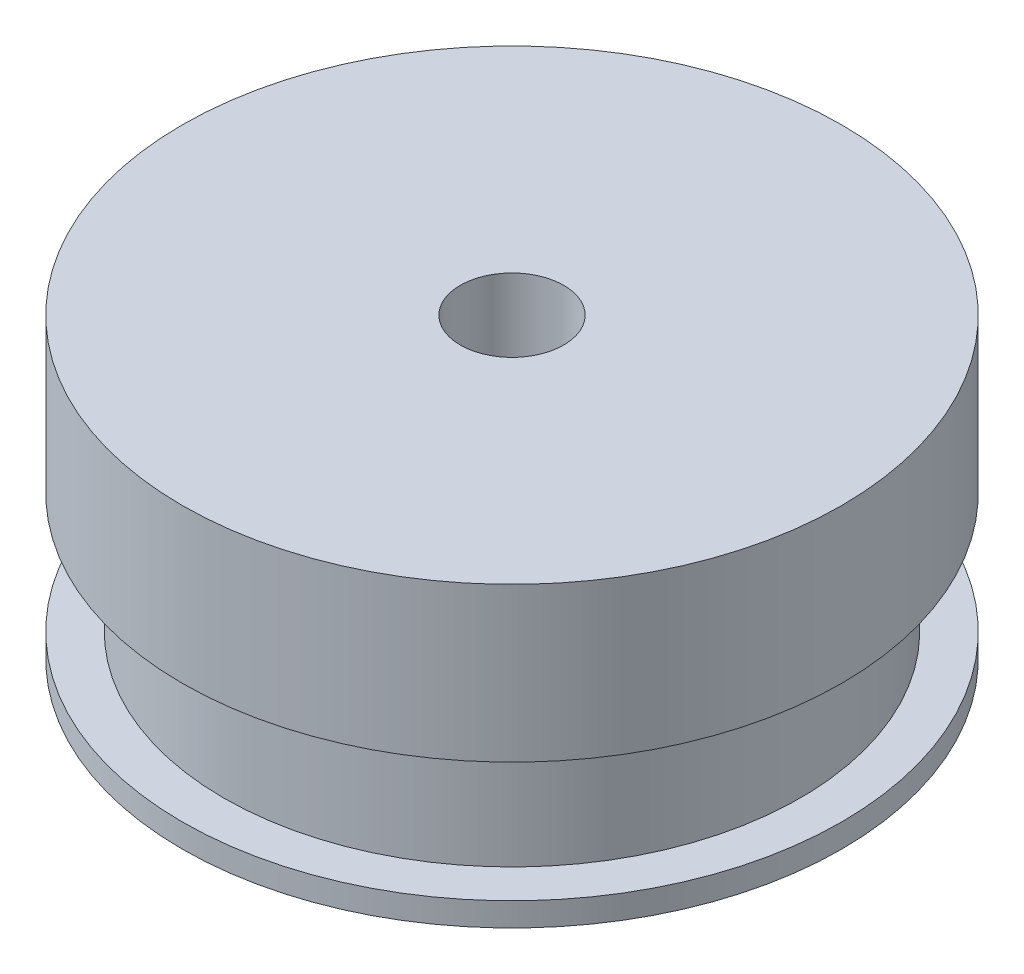
ISO-10303-21;
HEADER;
FILE_DESCRIPTION(('STEP AP214'),'2;1');
FILE_NAME('part.step','',(''),(''),'','','');
FILE_SCHEMA(('AUTOMOTIVE_DESIGN { 1 0 10303 214 1 1 1 1 }'));
ENDSEC;
DATA;
#1=APPLICATION_CONTEXT('core data for automotive mechanical design processes');
#2=APPLICATION_PROTOCOL_DEFINITION('international standard','automotive_design',2000,#1);
#3=PRODUCT_CONTEXT('',#1,'mechanical');
#4=PRODUCT('Part','Part','',(#3));
#5=PRODUCT_RELATED_PRODUCT_CATEGORY('part','',(#4));
#6=PRODUCT_DEFINITION_FORMATION('','',#4);
#7=PRODUCT_DEFINITION_CONTEXT('part definition',#1,'design');
#8=PRODUCT_DEFINITION('design','',#6,#7);
#9=PRODUCT_DEFINITION_SHAPE('','',#8);
#10=(LENGTH_UNIT() NAMED_UNIT(*) SI_UNIT(.MILLI.,.METRE.));
#11=(NAMED_UNIT(*) PLANE_ANGLE_UNIT() SI_UNIT($,.RADIAN.));
#12=(NAMED_UNIT(*) SI_UNIT($,.STERADIAN.) SOLID_ANGLE_UNIT());
#13=UNCERTAINTY_MEASURE_WITH_UNIT(LENGTH_MEASURE(1.E-05),#10,'distance_accuracy_value','');
#14=(GEOMETRIC_REPRESENTATION_CONTEXT(3) GLOBAL_UNCERTAINTY_ASSIGNED_CONTEXT((#13)) GLOBAL_UNIT_ASSIGNED_CONTEXT((#10,
#11,#12)) REPRESENTATION_CONTEXT('',''));
#15=CARTESIAN_POINT('',(0.,0.,0.));
#16=DIRECTION('',(0.,0.,1.));
#17=DIRECTION('',(1.,0.,0.));
#18=AXIS2_PLACEMENT_3D('',#15,#16,#17);
#19=CARTESIAN_POINT('',(0.,18.2626,0.));
#20=DIRECTION('',(0.,-1.,0.));
#21=DIRECTION('',(0.,0.,-1.));
#22=AXIS2_PLACEMENT_3D('',#19,#20,#21);
#23=CYLINDRICAL_SURFACE('',#22,20.2311);
#24=CARTESIAN_POINT('',(0.,0.,0.));
#25=DIRECTION('',(0.,1.,0.));
#26=DIRECTION('',(0.,0.,1.));
#27=AXIS2_PLACEMENT_3D('',#24,#25,#26);
#28=CIRCLE('',#27,20.2311);
#29=CARTESIAN_POINT('',(0.,0.,20.2311));
#30=VERTEX_POINT('',#29);
#31=EDGE_CURVE('E34',#30,#30,#28,.T.);
#32=ORIENTED_EDGE('',*,*,#31,.T.);
#33=EDGE_LOOP('',(#32));
#34=FACE_BOUND('',#33,.T.);
#35=CARTESIAN_POINT('',(0.,1.4478,0.));
#36=DIRECTION('',(0.,1.,0.));
#37=DIRECTION('',(0.,0.,1.));
#38=AXIS2_PLACEMENT_3D('',#35,#36,#37);
#39=CIRCLE('',#38,20.2311);
#40=CARTESIAN_POINT('',(0.,1.4478,20.2311));
#41=VERTEX_POINT('',#40);
#42=EDGE_CURVE('E46',#41,#41,#39,.T.);
#43=ORIENTED_EDGE('',*,*,#42,.F.);
#44=EDGE_LOOP('',(#43));
#45=FACE_BOUND('',#44,.T.);
#46=ADVANCED_FACE('F31',(#34,#45),#23,.T.);
#47=CARTESIAN_POINT('',(0.,18.2626,0.));
#48=DIRECTION('',(0.,1.,0.));
#49=DIRECTION('',(0.,0.,1.));
#50=AXIS2_PLACEMENT_3D('',#47,#48,#49);
#51=CIRCLE('',#50,20.2311);
#52=CARTESIAN_POINT('',(0.,18.2626,20.2311));
#53=VERTEX_POINT('',#52);
#54=EDGE_CURVE('E10',#53,#53,#51,.T.);
#55=ORIENTED_EDGE('',*,*,#54,.F.);
#56=EDGE_LOOP('',(#55));
#57=FACE_BOUND('',#56,.T.);
#58=CARTESIAN_POINT('',(0.,8.8138,0.));
#59=DIRECTION('',(0.,1.,0.));
#60=DIRECTION('',(0.,0.,1.));
#61=AXIS2_PLACEMENT_3D('',#58,#59,#60);
#62=CIRCLE('',#61,20.2311);
#63=CARTESIAN_POINT('',(0.,8.8138,20.2311));
#64=VERTEX_POINT('',#63);
#65=EDGE_CURVE('E57',#64,#64,#62,.T.);
#66=ORIENTED_EDGE('',*,*,#65,.T.);
#67=EDGE_LOOP('',(#66));
#68=FACE_BOUND('',#67,.T.);
#69=ADVANCED_FACE('F61',(#57,#68),#23,.T.);
#70=CARTESIAN_POINT('',(0.,18.2626,0.));
#71=DIRECTION('',(0.,1.,0.));
#72=DIRECTION('',(0.,0.,1.));
#73=AXIS2_PLACEMENT_3D('',#70,#71,#72);
#74=PLANE('',#73);
#75=ORIENTED_EDGE('',*,*,#54,.T.);
#76=EDGE_LOOP('',(#75));
#77=FACE_BOUND('',#76,.T.);
#78=CARTESIAN_POINT('',(0.,18.2626,0.));
#79=DIRECTION('',(0.,1.,0.));
#80=DIRECTION('',(0.,0.,1.));
#81=AXIS2_PLACEMENT_3D('',#78,#79,#80);
#82=CIRCLE('',#81,3.175);
#83=CARTESIAN_POINT('',(0.,18.2626,3.175));
#84=VERTEX_POINT('',#83);
#85=EDGE_CURVE('E41',#84,#84,#82,.T.);
#86=ORIENTED_EDGE('',*,*,#85,.F.);
#87=EDGE_LOOP('',(#86));
#88=FACE_BOUND('',#87,.T.);
#89=ADVANCED_FACE('F79',(#77,#88),#74,.T.);
#90=CARTESIAN_POINT('',(0.,0.,0.));
#91=DIRECTION('',(0.,1.,0.));
#92=DIRECTION('',(0.,0.,1.));
#93=AXIS2_PLACEMENT_3D('',#90,#91,#92);
#94=PLANE('',#93);
#95=ORIENTED_EDGE('',*,*,#31,.F.);
#96=EDGE_LOOP('',(#95));
#97=FACE_BOUND('',#96,.T.);
#98=CARTESIAN_POINT('',(0.,0.,0.));
#99=DIRECTION('',(0.,1.,0.));
#100=DIRECTION('',(0.,0.,1.));
#101=AXIS2_PLACEMENT_3D('',#98,#99,#100);
#102=CIRCLE('',#101,3.175);
#103=CARTESIAN_POINT('',(0.,0.,3.175));
#104=VERTEX_POINT('',#103);
#105=EDGE_CURVE('E43',#104,#104,#102,.T.);
#106=ORIENTED_EDGE('',*,*,#105,.T.);
#107=EDGE_LOOP('',(#106));
#108=FACE_BOUND('',#107,.T.);
#109=ADVANCED_FACE('F95',(#97,#108),#94,.F.);
#110=CARTESIAN_POINT('',(0.,18.2626,0.));
#111=DIRECTION('',(0.,-1.,0.));
#112=DIRECTION('',(0.,0.,-1.));
#113=AXIS2_PLACEMENT_3D('',#110,#111,#112);
#114=CYLINDRICAL_SURFACE('',#113,3.175);
#115=ORIENTED_EDGE('',*,*,#85,.T.);
#116=EDGE_LOOP('',(#115));
#117=FACE_BOUND('',#116,.T.);
#118=ORIENTED_EDGE('',*,*,#105,.F.);
#119=EDGE_LOOP('',(#118));
#120=FACE_BOUND('',#119,.T.);
#121=ADVANCED_FACE('F87',(#117,#120),#114,.F.);
#122=CARTESIAN_POINT('',(0.,1.4478,-20.2311));
#123=DIRECTION('',(0.,1.,0.));
#124=DIRECTION('',(0.,0.,1.));
#125=AXIS2_PLACEMENT_3D('',#122,#123,#124);
#126=PLANE('',#125);
#127=ORIENTED_EDGE('',*,*,#42,.T.);
#128=EDGE_LOOP('',(#127));
#129=FACE_BOUND('',#128,.T.);
#130=CARTESIAN_POINT('',(0.,1.4478,0.));
#131=DIRECTION('',(0.,1.,0.));
#132=DIRECTION('',(0.,0.,1.));
#133=AXIS2_PLACEMENT_3D('',#130,#131,#132);
#134=CIRCLE('',#133,17.6911);
#135=CARTESIAN_POINT('',(0.,1.4478,17.6911));
#136=VERTEX_POINT('',#135);
#137=EDGE_CURVE('E51',#136,#136,#134,.T.);
#138=ORIENTED_EDGE('',*,*,#137,.F.);
#139=EDGE_LOOP('',(#138));
#140=FACE_BOUND('',#139,.T.);
#141=ADVANCED_FACE('F71',(#129,#140),#126,.T.);
#142=CARTESIAN_POINT('',(0.,18.2626,0.));
#143=DIRECTION('',(0.,1.,0.));
#144=DIRECTION('',(0.,0.,1.));
#145=AXIS2_PLACEMENT_3D('',#142,#143,#144);
#146=CYLINDRICAL_SURFACE('',#145,17.6911);
#147=ORIENTED_EDGE('',*,*,#137,.T.);
#148=EDGE_LOOP('',(#147));
#149=FACE_BOUND('',#148,.T.);
#150=CARTESIAN_POINT('',(0.,8.8138,0.));
#151=DIRECTION('',(0.,1.,0.));
#152=DIRECTION('',(0.,0.,1.));
#153=AXIS2_PLACEMENT_3D('',#150,#151,#152);
#154=CIRCLE('',#153,17.6911);
#155=CARTESIAN_POINT('',(0.,8.8138,17.6911));
#156=VERTEX_POINT('',#155);
#157=EDGE_CURVE('E54',#156,#156,#154,.T.);
#158=ORIENTED_EDGE('',*,*,#157,.F.);
#159=EDGE_LOOP('',(#158));
#160=FACE_BOUND('',#159,.T.);
#161=ADVANCED_FACE('F65',(#149,#160),#146,.T.);
#162=CARTESIAN_POINT('',(0.,8.8138,-17.6911));
#163=DIRECTION('',(0.,-1.,0.));
#164=DIRECTION('',(0.,0.,-1.));
#165=AXIS2_PLACEMENT_3D('',#162,#163,#164);
#166=PLANE('',#165);
#167=ORIENTED_EDGE('',*,*,#157,.T.);
#168=EDGE_LOOP('',(#167));
#169=FACE_BOUND('',#168,.T.);
#170=ORIENTED_EDGE('',*,*,#65,.F.);
#171=EDGE_LOOP('',(#170));
#172=FACE_BOUND('',#171,.T.);
#173=ADVANCED_FACE('F63',(#169,#172),#166,.T.);
#174=CLOSED_SHELL('',(#46,#69,#89,#109,#121,#141,#161,#173));
#175=MANIFOLD_SOLID_BREP('B2',#174);
#176=ADVANCED_BREP_SHAPE_REPRESENTATION('',(#18,#175),#14);
#177=SHAPE_DEFINITION_REPRESENTATION(#9,#176);
ENDSEC;
END-ISO-10303-21;
